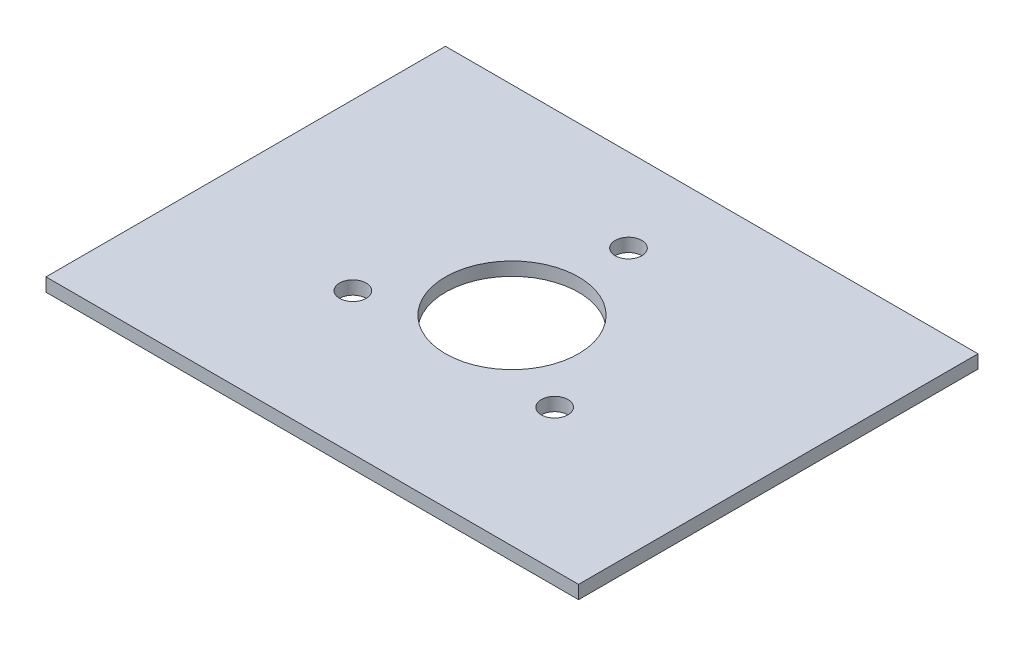
ISO-10303-21;
HEADER;
FILE_DESCRIPTION(('STEP AP214'),'2;1');
FILE_NAME('part.step','',(''),(''),'','','');
FILE_SCHEMA(('AUTOMOTIVE_DESIGN { 1 0 10303 214 1 1 1 1 }'));
ENDSEC;
DATA;
#1=APPLICATION_CONTEXT('core data for automotive mechanical design processes');
#2=APPLICATION_PROTOCOL_DEFINITION('international standard','automotive_design',2000,#1);
#3=PRODUCT_CONTEXT('',#1,'mechanical');
#4=PRODUCT('Part','Part','',(#3));
#5=PRODUCT_RELATED_PRODUCT_CATEGORY('part','',(#4));
#6=PRODUCT_DEFINITION_FORMATION('','',#4);
#7=PRODUCT_DEFINITION_CONTEXT('part definition',#1,'design');
#8=PRODUCT_DEFINITION('design','',#6,#7);
#9=PRODUCT_DEFINITION_SHAPE('','',#8);
#10=(LENGTH_UNIT() NAMED_UNIT(*) SI_UNIT(.MILLI.,.METRE.));
#11=(NAMED_UNIT(*) PLANE_ANGLE_UNIT() SI_UNIT($,.RADIAN.));
#12=(NAMED_UNIT(*) SI_UNIT($,.STERADIAN.) SOLID_ANGLE_UNIT());
#13=UNCERTAINTY_MEASURE_WITH_UNIT(LENGTH_MEASURE(1.E-05),#10,'distance_accuracy_value','');
#14=(GEOMETRIC_REPRESENTATION_CONTEXT(3) GLOBAL_UNCERTAINTY_ASSIGNED_CONTEXT((#13)) GLOBAL_UNIT_ASSIGNED_CONTEXT((#10,
#11,#12)) REPRESENTATION_CONTEXT('',''));
#15=CARTESIAN_POINT('',(0.,0.,0.));
#16=DIRECTION('',(0.,0.,1.));
#17=DIRECTION('',(1.,0.,0.));
#18=AXIS2_PLACEMENT_3D('',#15,#16,#17);
#19=CARTESIAN_POINT('',(0.,2.,0.));
#20=DIRECTION('',(0.,-1.,0.));
#21=DIRECTION('',(0.,0.,-1.));
#22=AXIS2_PLACEMENT_3D('',#19,#20,#21);
#23=PLANE('',#22);
#24=DIRECTION('',(0.,0.,-1.));
#25=VECTOR('',#24,1.);
#26=CARTESIAN_POINT('',(40.,2.,30.));
#27=LINE('',#26,#25);
#28=CARTESIAN_POINT('',(40.,2.,30.));
#29=VERTEX_POINT('',#28);
#30=CARTESIAN_POINT('',(40.,2.,-30.));
#31=VERTEX_POINT('',#30);
#32=EDGE_CURVE('E87',#29,#31,#27,.T.);
#33=ORIENTED_EDGE('',*,*,#32,.T.);
#34=DIRECTION('',(-1.,0.,0.));
#35=VECTOR('',#34,1.);
#36=CARTESIAN_POINT('',(-40.,2.,-30.));
#37=LINE('',#36,#35);
#38=CARTESIAN_POINT('',(-40.,2.,-30.));
#39=VERTEX_POINT('',#38);
#40=EDGE_CURVE('E82',#31,#39,#37,.T.);
#41=ORIENTED_EDGE('',*,*,#40,.T.);
#42=DIRECTION('',(0.,0.,1.));
#43=VECTOR('',#42,1.);
#44=CARTESIAN_POINT('',(-40.,2.,30.));
#45=LINE('',#44,#43);
#46=CARTESIAN_POINT('',(-40.,2.,30.));
#47=VERTEX_POINT('',#46);
#48=EDGE_CURVE('E85',#39,#47,#45,.T.);
#49=ORIENTED_EDGE('',*,*,#48,.T.);
#50=DIRECTION('',(1.,0.,0.));
#51=VECTOR('',#50,1.);
#52=CARTESIAN_POINT('',(-40.,2.,30.));
#53=LINE('',#52,#51);
#54=EDGE_CURVE('E52',#47,#29,#53,.T.);
#55=ORIENTED_EDGE('',*,*,#54,.T.);
#56=EDGE_LOOP('',(#33,#41,#49,#55));
#57=FACE_BOUND('',#56,.T.);
#58=CARTESIAN_POINT('',(15.1554445662277,2.,8.75000000000002));
#59=DIRECTION('',(0.,1.,0.));
#60=DIRECTION('',(0.,0.,1.));
#61=AXIS2_PLACEMENT_3D('',#58,#59,#60);
#62=CIRCLE('',#61,2.00000000000001);
#63=CARTESIAN_POINT('',(15.1554445662277,2.,10.75));
#64=VERTEX_POINT('',#63);
#65=EDGE_CURVE('E102',#64,#64,#62,.T.);
#66=ORIENTED_EDGE('',*,*,#65,.F.);
#67=EDGE_LOOP('',(#66));
#68=FACE_BOUND('',#67,.T.);
#69=CARTESIAN_POINT('',(-15.1554445662277,2.,8.74999999999999));
#70=DIRECTION('',(0.,1.,0.));
#71=DIRECTION('',(0.,0.,1.));
#72=AXIS2_PLACEMENT_3D('',#69,#70,#71);
#73=CIRCLE('',#72,2.00000000000001);
#74=CARTESIAN_POINT('',(-15.1554445662277,2.,10.75));
#75=VERTEX_POINT('',#74);
#76=EDGE_CURVE('E117',#75,#75,#73,.T.);
#77=ORIENTED_EDGE('',*,*,#76,.F.);
#78=EDGE_LOOP('',(#77));
#79=FACE_BOUND('',#78,.T.);
#80=CARTESIAN_POINT('',(0.,2.,-17.5));
#81=DIRECTION('',(0.,1.,0.));
#82=DIRECTION('',(0.,0.,1.));
#83=AXIS2_PLACEMENT_3D('',#80,#81,#82);
#84=CIRCLE('',#83,2.00000000000001);
#85=CARTESIAN_POINT('',(0.,2.,-15.5));
#86=VERTEX_POINT('',#85);
#87=EDGE_CURVE('E123',#86,#86,#84,.T.);
#88=ORIENTED_EDGE('',*,*,#87,.F.);
#89=EDGE_LOOP('',(#88));
#90=FACE_BOUND('',#89,.T.);
#91=CARTESIAN_POINT('',(0.,2.,0.));
#92=DIRECTION('',(0.,1.,0.));
#93=DIRECTION('',(0.,0.,1.));
#94=AXIS2_PLACEMENT_3D('',#91,#92,#93);
#95=CIRCLE('',#94,10.);
#96=CARTESIAN_POINT('',(0.,2.,9.99999999999999));
#97=VERTEX_POINT('',#96);
#98=EDGE_CURVE('E129',#97,#97,#95,.T.);
#99=ORIENTED_EDGE('',*,*,#98,.F.);
#100=EDGE_LOOP('',(#99));
#101=FACE_BOUND('',#100,.T.);
#102=ADVANCED_FACE('F35',(#57,#68,#79,#90,#101),#23,.F.);
#103=CARTESIAN_POINT('',(0.,0.,0.));
#104=DIRECTION('',(0.,-1.,0.));
#105=DIRECTION('',(0.,0.,-1.));
#106=AXIS2_PLACEMENT_3D('',#103,#104,#105);
#107=PLANE('',#106);
#108=CARTESIAN_POINT('',(0.,0.,-17.5));
#109=DIRECTION('',(0.,1.,0.));
#110=DIRECTION('',(0.,0.,1.));
#111=AXIS2_PLACEMENT_3D('',#108,#109,#110);
#112=CIRCLE('',#111,2.00000000000001);
#113=CARTESIAN_POINT('',(0.,0.,-15.5));
#114=VERTEX_POINT('',#113);
#115=EDGE_CURVE('E126',#114,#114,#112,.T.);
#116=ORIENTED_EDGE('',*,*,#115,.T.);
#117=EDGE_LOOP('',(#116));
#118=FACE_BOUND('',#117,.T.);
#119=CARTESIAN_POINT('',(15.1554445662277,0.,8.75000000000002));
#120=DIRECTION('',(0.,1.,0.));
#121=DIRECTION('',(0.,0.,1.));
#122=AXIS2_PLACEMENT_3D('',#119,#120,#121);
#123=CIRCLE('',#122,2.00000000000001);
#124=CARTESIAN_POINT('',(15.1554445662277,0.,10.75));
#125=VERTEX_POINT('',#124);
#126=EDGE_CURVE('E114',#125,#125,#123,.T.);
#127=ORIENTED_EDGE('',*,*,#126,.T.);
#128=EDGE_LOOP('',(#127));
#129=FACE_BOUND('',#128,.T.);
#130=DIRECTION('',(0.,0.,-1.));
#131=VECTOR('',#130,1.);
#132=CARTESIAN_POINT('',(40.,0.,30.));
#133=LINE('',#132,#131);
#134=CARTESIAN_POINT('',(40.,0.,30.));
#135=VERTEX_POINT('',#134);
#136=CARTESIAN_POINT('',(40.,0.,-30.));
#137=VERTEX_POINT('',#136);
#138=EDGE_CURVE('E99',#135,#137,#133,.T.);
#139=ORIENTED_EDGE('',*,*,#138,.F.);
#140=DIRECTION('',(1.,0.,0.));
#141=VECTOR('',#140,1.);
#142=CARTESIAN_POINT('',(-40.,0.,30.));
#143=LINE('',#142,#141);
#144=CARTESIAN_POINT('',(-40.,0.,30.));
#145=VERTEX_POINT('',#144);
#146=EDGE_CURVE('E75',#145,#135,#143,.T.);
#147=ORIENTED_EDGE('',*,*,#146,.F.);
#148=DIRECTION('',(0.,0.,1.));
#149=VECTOR('',#148,1.);
#150=CARTESIAN_POINT('',(-40.,0.,30.));
#151=LINE('',#150,#149);
#152=CARTESIAN_POINT('',(-40.,0.,-30.));
#153=VERTEX_POINT('',#152);
#154=EDGE_CURVE('E69',#153,#145,#151,.T.);
#155=ORIENTED_EDGE('',*,*,#154,.F.);
#156=DIRECTION('',(-1.,0.,0.));
#157=VECTOR('',#156,1.);
#158=CARTESIAN_POINT('',(-40.,0.,-30.));
#159=LINE('',#158,#157);
#160=EDGE_CURVE('E91',#137,#153,#159,.T.);
#161=ORIENTED_EDGE('',*,*,#160,.F.);
#162=EDGE_LOOP('',(#139,#147,#155,#161));
#163=FACE_BOUND('',#162,.T.);
#164=CARTESIAN_POINT('',(-15.1554445662277,0.,8.74999999999999));
#165=DIRECTION('',(0.,1.,0.));
#166=DIRECTION('',(0.,0.,1.));
#167=AXIS2_PLACEMENT_3D('',#164,#165,#166);
#168=CIRCLE('',#167,2.00000000000001);
#169=CARTESIAN_POINT('',(-15.1554445662277,0.,10.75));
#170=VERTEX_POINT('',#169);
#171=EDGE_CURVE('E120',#170,#170,#168,.T.);
#172=ORIENTED_EDGE('',*,*,#171,.T.);
#173=EDGE_LOOP('',(#172));
#174=FACE_BOUND('',#173,.T.);
#175=CARTESIAN_POINT('',(0.,0.,0.));
#176=DIRECTION('',(0.,1.,0.));
#177=DIRECTION('',(0.,0.,1.));
#178=AXIS2_PLACEMENT_3D('',#175,#176,#177);
#179=CIRCLE('',#178,10.);
#180=CARTESIAN_POINT('',(0.,0.,9.99999999999999));
#181=VERTEX_POINT('',#180);
#182=EDGE_CURVE('E132',#181,#181,#179,.T.);
#183=ORIENTED_EDGE('',*,*,#182,.T.);
#184=EDGE_LOOP('',(#183));
#185=FACE_BOUND('',#184,.T.);
#186=ADVANCED_FACE('F110',(#118,#129,#163,#174,#185),#107,.T.);
#187=CARTESIAN_POINT('',(40.,2.,30.));
#188=DIRECTION('',(-1.,0.,0.));
#189=DIRECTION('',(0.,0.,1.));
#190=AXIS2_PLACEMENT_3D('',#187,#188,#189);
#191=PLANE('',#190);
#192=ORIENTED_EDGE('',*,*,#138,.T.);
#193=DIRECTION('',(0.,-1.,0.));
#194=VECTOR('',#193,1.);
#195=CARTESIAN_POINT('',(40.,2.,-30.));
#196=LINE('',#195,#194);
#197=EDGE_CURVE('E11',#31,#137,#196,.T.);
#198=ORIENTED_EDGE('',*,*,#197,.F.);
#199=ORIENTED_EDGE('',*,*,#32,.F.);
#200=DIRECTION('',(0.,-1.,0.));
#201=VECTOR('',#200,1.);
#202=CARTESIAN_POINT('',(40.,2.,30.));
#203=LINE('',#202,#201);
#204=EDGE_CURVE('E95',#29,#135,#203,.T.);
#205=ORIENTED_EDGE('',*,*,#204,.T.);
#206=EDGE_LOOP('',(#192,#198,#199,#205));
#207=FACE_BOUND('',#206,.T.);
#208=ADVANCED_FACE('F37',(#207),#191,.F.);
#209=CARTESIAN_POINT('',(-40.,2.,-30.));
#210=DIRECTION('',(0.,0.,1.));
#211=DIRECTION('',(1.,0.,0.));
#212=AXIS2_PLACEMENT_3D('',#209,#210,#211);
#213=PLANE('',#212);
#214=ORIENTED_EDGE('',*,*,#160,.T.);
#215=DIRECTION('',(0.,-1.,0.));
#216=VECTOR('',#215,1.);
#217=CARTESIAN_POINT('',(-40.,2.,-30.));
#218=LINE('',#217,#216);
#219=EDGE_CURVE('E44',#39,#153,#218,.T.);
#220=ORIENTED_EDGE('',*,*,#219,.F.);
#221=ORIENTED_EDGE('',*,*,#40,.F.);
#222=ORIENTED_EDGE('',*,*,#197,.T.);
#223=EDGE_LOOP('',(#214,#220,#221,#222));
#224=FACE_BOUND('',#223,.T.);
#225=ADVANCED_FACE('F90',(#224),#213,.F.);
#226=CARTESIAN_POINT('',(-40.,2.,30.));
#227=DIRECTION('',(1.,0.,0.));
#228=DIRECTION('',(0.,0.,-1.));
#229=AXIS2_PLACEMENT_3D('',#226,#227,#228);
#230=PLANE('',#229);
#231=ORIENTED_EDGE('',*,*,#154,.T.);
#232=DIRECTION('',(0.,-1.,0.));
#233=VECTOR('',#232,1.);
#234=CARTESIAN_POINT('',(-40.,2.,30.));
#235=LINE('',#234,#233);
#236=EDGE_CURVE('E92',#47,#145,#235,.T.);
#237=ORIENTED_EDGE('',*,*,#236,.F.);
#238=ORIENTED_EDGE('',*,*,#48,.F.);
#239=ORIENTED_EDGE('',*,*,#219,.T.);
#240=EDGE_LOOP('',(#231,#237,#238,#239));
#241=FACE_BOUND('',#240,.T.);
#242=ADVANCED_FACE('F93',(#241),#230,.F.);
#243=CARTESIAN_POINT('',(-40.,2.,30.));
#244=DIRECTION('',(0.,0.,-1.));
#245=DIRECTION('',(-1.,0.,0.));
#246=AXIS2_PLACEMENT_3D('',#243,#244,#245);
#247=PLANE('',#246);
#248=ORIENTED_EDGE('',*,*,#146,.T.);
#249=ORIENTED_EDGE('',*,*,#204,.F.);
#250=ORIENTED_EDGE('',*,*,#54,.F.);
#251=ORIENTED_EDGE('',*,*,#236,.T.);
#252=EDGE_LOOP('',(#248,#249,#250,#251));
#253=FACE_BOUND('',#252,.T.);
#254=ADVANCED_FACE('F107',(#253),#247,.F.);
#255=CARTESIAN_POINT('',(15.1554445662277,2.,8.75000000000002));
#256=DIRECTION('',(0.,-1.,0.));
#257=DIRECTION('',(0.,0.,-1.));
#258=AXIS2_PLACEMENT_3D('',#255,#256,#257);
#259=CYLINDRICAL_SURFACE('',#258,2.00000000000001);
#260=ORIENTED_EDGE('',*,*,#65,.T.);
#261=EDGE_LOOP('',(#260));
#262=FACE_BOUND('',#261,.T.);
#263=ORIENTED_EDGE('',*,*,#126,.F.);
#264=EDGE_LOOP('',(#263));
#265=FACE_BOUND('',#264,.T.);
#266=ADVANCED_FACE('F149',(#262,#265),#259,.F.);
#267=CARTESIAN_POINT('',(-15.1554445662277,2.,8.74999999999999));
#268=DIRECTION('',(0.,-1.,0.));
#269=DIRECTION('',(0.,0.,-1.));
#270=AXIS2_PLACEMENT_3D('',#267,#268,#269);
#271=CYLINDRICAL_SURFACE('',#270,2.00000000000001);
#272=ORIENTED_EDGE('',*,*,#76,.T.);
#273=EDGE_LOOP('',(#272));
#274=FACE_BOUND('',#273,.T.);
#275=ORIENTED_EDGE('',*,*,#171,.F.);
#276=EDGE_LOOP('',(#275));
#277=FACE_BOUND('',#276,.T.);
#278=ADVANCED_FACE('F195',(#274,#277),#271,.F.);
#279=CARTESIAN_POINT('',(0.,2.,-17.5));
#280=DIRECTION('',(0.,-1.,0.));
#281=DIRECTION('',(0.,0.,-1.));
#282=AXIS2_PLACEMENT_3D('',#279,#280,#281);
#283=CYLINDRICAL_SURFACE('',#282,2.00000000000001);
#284=ORIENTED_EDGE('',*,*,#87,.T.);
#285=EDGE_LOOP('',(#284));
#286=FACE_BOUND('',#285,.T.);
#287=ORIENTED_EDGE('',*,*,#115,.F.);
#288=EDGE_LOOP('',(#287));
#289=FACE_BOUND('',#288,.T.);
#290=ADVANCED_FACE('F203',(#286,#289),#283,.F.);
#291=CARTESIAN_POINT('',(0.,2.,0.));
#292=DIRECTION('',(0.,-1.,0.));
#293=DIRECTION('',(0.,0.,-1.));
#294=AXIS2_PLACEMENT_3D('',#291,#292,#293);
#295=CYLINDRICAL_SURFACE('',#294,10.);
#296=ORIENTED_EDGE('',*,*,#98,.T.);
#297=EDGE_LOOP('',(#296));
#298=FACE_BOUND('',#297,.T.);
#299=ORIENTED_EDGE('',*,*,#182,.F.);
#300=EDGE_LOOP('',(#299));
#301=FACE_BOUND('',#300,.T.);
#302=ADVANCED_FACE('F138',(#298,#301),#295,.F.);
#303=CLOSED_SHELL('',(#102,#186,#208,#225,#242,#254,#266,#278,#290,#302));
#304=MANIFOLD_SOLID_BREP('B2',#303);
#305=ADVANCED_BREP_SHAPE_REPRESENTATION('',(#18,#304),#14);
#306=SHAPE_DEFINITION_REPRESENTATION(#9,#305);
ENDSEC;
END-ISO-10303-21;
